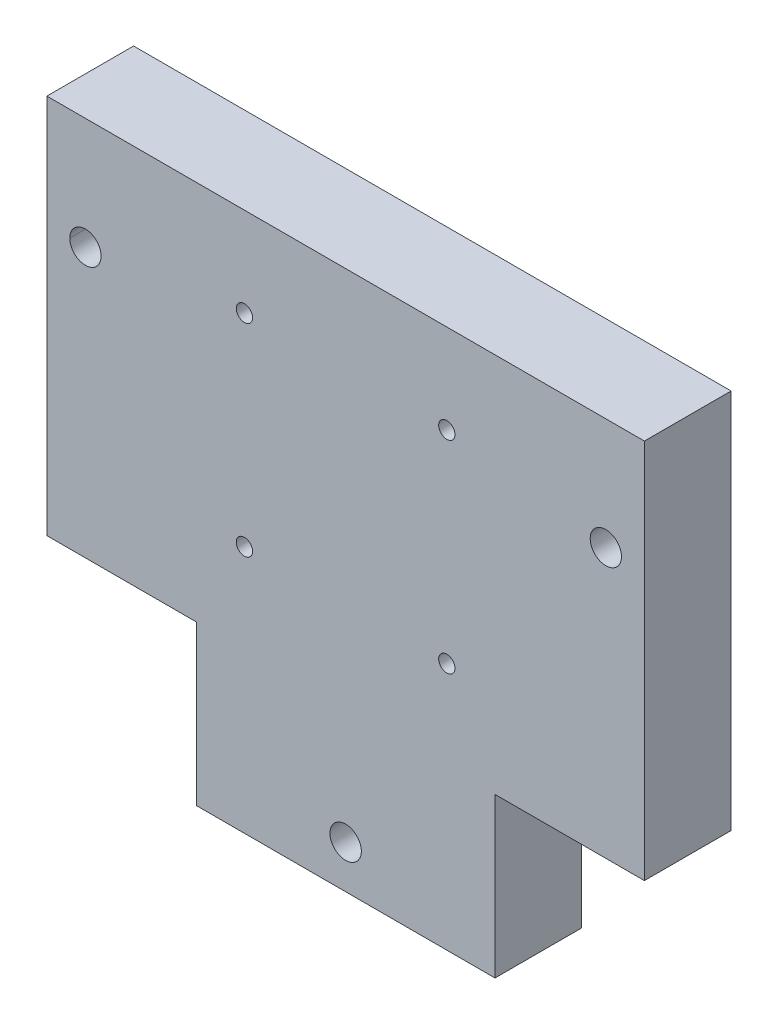
ISO-10303-21;
HEADER;
FILE_DESCRIPTION(('STEP AP214'),'2;1');
FILE_NAME('part.step','',(''),(''),'','','');
FILE_SCHEMA(('AUTOMOTIVE_DESIGN { 1 0 10303 214 1 1 1 1 }'));
ENDSEC;
DATA;
#1=APPLICATION_CONTEXT('core data for automotive mechanical design processes');
#2=APPLICATION_PROTOCOL_DEFINITION('international standard','automotive_design',2000,#1);
#3=PRODUCT_CONTEXT('',#1,'mechanical');
#4=PRODUCT('Part','Part','',(#3));
#5=PRODUCT_RELATED_PRODUCT_CATEGORY('part','',(#4));
#6=PRODUCT_DEFINITION_FORMATION('','',#4);
#7=PRODUCT_DEFINITION_CONTEXT('part definition',#1,'design');
#8=PRODUCT_DEFINITION('design','',#6,#7);
#9=PRODUCT_DEFINITION_SHAPE('','',#8);
#10=(LENGTH_UNIT() NAMED_UNIT(*) SI_UNIT(.MILLI.,.METRE.));
#11=(NAMED_UNIT(*) PLANE_ANGLE_UNIT() SI_UNIT($,.RADIAN.));
#12=(NAMED_UNIT(*) SI_UNIT($,.STERADIAN.) SOLID_ANGLE_UNIT());
#13=UNCERTAINTY_MEASURE_WITH_UNIT(LENGTH_MEASURE(1.E-05),#10,'distance_accuracy_value','');
#14=(GEOMETRIC_REPRESENTATION_CONTEXT(3) GLOBAL_UNCERTAINTY_ASSIGNED_CONTEXT((#13)) GLOBAL_UNIT_ASSIGNED_CONTEXT((#10,
#11,#12)) REPRESENTATION_CONTEXT('',''));
#15=CARTESIAN_POINT('',(0.,0.,0.));
#16=DIRECTION('',(0.,0.,1.));
#17=DIRECTION('',(1.,0.,0.));
#18=AXIS2_PLACEMENT_3D('',#15,#16,#17);
#19=CARTESIAN_POINT('',(21.0000994212728,-20.2002262396206,9.49960056521751));
#20=DIRECTION('',(-9.13544996192521E-05,0.000141096182968111,0.999999985873111));
#21=DIRECTION('',(0.,-0.999999990045933,0.000141096183556881));
#22=AXIS2_PLACEMENT_3D('',#19,#20,#21);
#23=CYLINDRICAL_SURFACE('',#22,1.69302641376225);
#24=CARTESIAN_POINT('',(20.9998253212629,-20.1998028946808,12.5000001862645));
#25=DIRECTION('',(0.,0.,-1.));
#26=DIRECTION('',(-0.543490157101904,0.839415540202436,0.));
#27=AXIS2_PLACEMENT_3D('',#24,#25,#26);
#28=ELLIPSE('',#27,1.69302643767944,1.69302641376225);
#29=CARTESIAN_POINT('',(20.0796821166708,-18.7786501929191,12.5000001862645));
#30=VERTEX_POINT('',#29);
#31=EDGE_CURVE('E48',#30,#30,#28,.F.);
#32=ORIENTED_EDGE('',*,*,#31,.T.);
#33=EDGE_LOOP('',(#32));
#34=FACE_BOUND('',#33,.T.);
#35=CARTESIAN_POINT('',(21.0000537075526,-20.200155635201,9.99999977648258));
#36=DIRECTION('',(0.,0.,-1.));
#37=DIRECTION('',(-0.543490157101904,0.839415540202436,0.));
#38=AXIS2_PLACEMENT_3D('',#35,#36,#37);
#39=ELLIPSE('',#38,1.69302643767944,1.69302641376225);
#40=CARTESIAN_POINT('',(20.0799105029605,-18.7790029334393,9.99999977648258));
#41=VERTEX_POINT('',#40);
#42=EDGE_CURVE('E11',#41,#41,#39,.T.);
#43=ORIENTED_EDGE('',*,*,#42,.T.);
#44=EDGE_LOOP('',(#43));
#45=FACE_BOUND('',#44,.T.);
#46=ADVANCED_FACE('F44',(#34,#45),#23,.F.);
#47=CARTESIAN_POINT('',(0.,0.,9.99999977648258));
#48=DIRECTION('',(0.,0.,-1.));
#49=DIRECTION('',(-1.,0.,0.));
#50=AXIS2_PLACEMENT_3D('',#47,#48,#49);
#51=PLANE('',#50);
#52=ORIENTED_EDGE('',*,*,#42,.F.);
#53=EDGE_LOOP('',(#52));
#54=FACE_BOUND('',#53,.T.);
#55=CARTESIAN_POINT('',(20.9999978455012,-20.2000122749202,9.99999977648258));
#56=DIRECTION('',(0.,0.,-1.));
#57=DIRECTION('',(-1.,0.,0.));
#58=AXIS2_PLACEMENT_3D('',#55,#56,#57);
#59=CIRCLE('',#58,3.24958794707544);
#60=CARTESIAN_POINT('',(17.7504098984257,-20.2000122749202,9.99999977648258));
#61=VERTEX_POINT('',#60);
#62=EDGE_CURVE('E298',#61,#61,#59,.T.);
#63=ORIENTED_EDGE('',*,*,#62,.T.);
#64=EDGE_LOOP('',(#63));
#65=FACE_BOUND('',#64,.T.);
#66=ADVANCED_FACE('F317',(#54,#65),#51,.T.);
#67=CARTESIAN_POINT('',(0.,0.,12.5000001862645));
#68=DIRECTION('',(0.,0.,-1.));
#69=DIRECTION('',(-1.,0.,0.));
#70=AXIS2_PLACEMENT_3D('',#67,#68,#69);
#71=PLANE('',#70);
#72=ORIENTED_EDGE('',*,*,#31,.F.);
#73=EDGE_LOOP('',(#72));
#74=FACE_BOUND('',#73,.T.);
#75=CARTESIAN_POINT('',(20.9998906302595,-62.1998686107718,12.5000001862645));
#76=DIRECTION('',(0.,0.,-1.));
#77=DIRECTION('',(-0.542457009571879,0.840083562966408,0.));
#78=AXIS2_PLACEMENT_3D('',#75,#76,#77);
#79=ELLIPSE('',#78,1.6930265143369,1.693026490353);
#80=CARTESIAN_POINT('',(20.0814965301664,-60.777584864411,12.5000001862645));
#81=VERTEX_POINT('',#80);
#82=EDGE_CURVE('E270',#81,#81,#79,.F.);
#83=ORIENTED_EDGE('',*,*,#82,.F.);
#84=EDGE_LOOP('',(#83));
#85=FACE_BOUND('',#84,.T.);
#86=CARTESIAN_POINT('',(-21.0001700776299,-20.1998009332168,12.5000001862645));
#87=DIRECTION('',(0.,0.,-1.));
#88=DIRECTION('',(-0.542863582539299,0.83982089206723,0.));
#89=AXIS2_PLACEMENT_3D('',#86,#87,#88);
#90=ELLIPSE('',#89,1.69302645938213,1.69302643547463);
#91=CARTESIAN_POINT('',(-21.9192524867039,-18.7779619418051,12.5000001862645));
#92=VERTEX_POINT('',#91);
#93=EDGE_CURVE('E271',#92,#92,#90,.F.);
#94=ORIENTED_EDGE('',*,*,#93,.F.);
#95=EDGE_LOOP('',(#94));
#96=FACE_BOUND('',#95,.T.);
#97=DIRECTION('',(0.,-1.,0.));
#98=VECTOR('',#97,1.);
#99=CARTESIAN_POINT('',(30.9999957680702,0.,12.5000001862645));
#100=LINE('',#99,#98);
#101=CARTESIAN_POINT('',(30.9999957680702,-80.700010061264,12.5000001862645));
#102=VERTEX_POINT('',#101);
#103=CARTESIAN_POINT('',(30.9999957680702,-113.70000988245,12.5000001862645));
#104=VERTEX_POINT('',#103);
#105=EDGE_CURVE('E163',#102,#104,#100,.T.);
#106=ORIENTED_EDGE('',*,*,#105,.F.);
#107=DIRECTION('',(1.,0.,0.));
#108=VECTOR('',#107,1.);
#109=CARTESIAN_POINT('',(0.,-80.700010061264,12.5000001862645));
#110=LINE('',#109,#108);
#111=CARTESIAN_POINT('',(61.9999952614307,-80.700010061264,12.5000001862645));
#112=VERTEX_POINT('',#111);
#113=EDGE_CURVE('E189',#102,#112,#110,.T.);
#114=ORIENTED_EDGE('',*,*,#113,.T.);
#115=DIRECTION('',(0.,-1.,0.));
#116=VECTOR('',#115,1.);
#117=CARTESIAN_POINT('',(61.9999952614307,0.,12.5000001862645));
#118=LINE('',#117,#116);
#119=CARTESIAN_POINT('',(61.9999952614307,-1.7000122461468,12.5000001862645));
#120=VERTEX_POINT('',#119);
#121=EDGE_CURVE('E132',#120,#112,#118,.T.);
#122=ORIENTED_EDGE('',*,*,#121,.F.);
#123=DIRECTION('',(-1.,0.,0.));
#124=VECTOR('',#123,1.);
#125=CARTESIAN_POINT('',(0.,-1.7000122461468,12.5000001862645));
#126=LINE('',#125,#124);
#127=CARTESIAN_POINT('',(-61.9999952614307,-1.7000122461468,12.5000001862645));
#128=VERTEX_POINT('',#127);
#129=EDGE_CURVE('E124',#120,#128,#126,.T.);
#130=ORIENTED_EDGE('',*,*,#129,.T.);
#131=DIRECTION('',(0.,-1.,0.));
#132=VECTOR('',#131,1.);
#133=CARTESIAN_POINT('',(-61.9999952614307,0.,12.5000001862645));
#134=LINE('',#133,#132);
#135=CARTESIAN_POINT('',(-61.9999952614307,-80.700010061264,12.5000001862645));
#136=VERTEX_POINT('',#135);
#137=EDGE_CURVE('E129',#128,#136,#134,.T.);
#138=ORIENTED_EDGE('',*,*,#137,.T.);
#139=DIRECTION('',(1.,0.,0.));
#140=VECTOR('',#139,1.);
#141=CARTESIAN_POINT('',(0.,-80.700010061264,12.5000001862645));
#142=LINE('',#141,#140);
#143=CARTESIAN_POINT('',(-30.9999957680702,-80.700010061264,12.5000001862645));
#144=VERTEX_POINT('',#143);
#145=EDGE_CURVE('E154',#136,#144,#142,.T.);
#146=ORIENTED_EDGE('',*,*,#145,.T.);
#147=DIRECTION('',(0.,-1.,0.));
#148=VECTOR('',#147,1.);
#149=CARTESIAN_POINT('',(-30.9999957680702,0.,12.5000001862645));
#150=LINE('',#149,#148);
#151=CARTESIAN_POINT('',(-30.9999957680702,-113.70000988245,12.5000001862645));
#152=VERTEX_POINT('',#151);
#153=EDGE_CURVE('E212',#144,#152,#150,.T.);
#154=ORIENTED_EDGE('',*,*,#153,.T.);
#155=DIRECTION('',(1.,0.,0.));
#156=VECTOR('',#155,1.);
#157=CARTESIAN_POINT('',(0.,-113.70000988245,12.5000001862645));
#158=LINE('',#157,#156);
#159=EDGE_CURVE('E168',#152,#104,#158,.T.);
#160=ORIENTED_EDGE('',*,*,#159,.T.);
#161=EDGE_LOOP('',(#106,#114,#122,#130,#138,#146,#154,#160));
#162=FACE_BOUND('',#161,.T.);
#163=CARTESIAN_POINT('',(-2.62684949260354E-05,-104.802861809733,12.5000001862645));
#164=DIRECTION('',(0.,0.,-1.));
#165=DIRECTION('',(-1.,0.,0.));
#166=AXIS2_PLACEMENT_3D('',#163,#164,#165);
#167=CIRCLE('',#166,3.25844640930602);
#168=CARTESIAN_POINT('',(-3.25847267780095,-104.802861809733,12.5000001862645));
#169=VERTEX_POINT('',#168);
#170=EDGE_CURVE('E206',#169,#169,#167,.F.);
#171=ORIENTED_EDGE('',*,*,#170,.F.);
#172=EDGE_LOOP('',(#171));
#173=FACE_BOUND('',#172,.T.);
#174=CARTESIAN_POINT('',(54.002082180397,-24.8557608755458,12.5000001862645));
#175=DIRECTION('',(0.,0.,-1.));
#176=DIRECTION('',(0.591464294699841,-0.806331190079622,0.));
#177=AXIS2_PLACEMENT_3D('',#174,#175,#176);
#178=ELLIPSE('',#177,3.24859697148728,3.24859673586021);
#179=CARTESIAN_POINT('',(55.9235112969017,-27.4752059376542,12.5000001862645));
#180=VERTEX_POINT('',#179);
#181=EDGE_CURVE('E218',#180,#180,#178,.F.);
#182=ORIENTED_EDGE('',*,*,#181,.F.);
#183=EDGE_LOOP('',(#182));
#184=FACE_BOUND('',#183,.T.);
#185=CARTESIAN_POINT('',(-54.0000051259997,-24.8401146382096,12.5000001862645));
#186=DIRECTION('',(0.,0.,-1.));
#187=DIRECTION('',(-1.,0.,0.));
#188=AXIS2_PLACEMENT_3D('',#185,#186,#187);
#189=CIRCLE('',#188,3.25126588995524);
#190=CARTESIAN_POINT('',(-50.7487785348697,-24.8561002666336,12.5000001862645));
#191=VERTEX_POINT('',#190);
#192=CARTESIAN_POINT('',(-57.2512575855917,-24.8494597536648,12.5000001862645));
#193=VERTEX_POINT('',#192);
#194=EDGE_CURVE('E147',#191,#193,#189,.F.);
#195=ORIENTED_EDGE('',*,*,#194,.F.);
#196=CARTESIAN_POINT('',(-54.0000312030563,-24.8656496405951,12.5000001862645));
#197=DIRECTION('',(0.,0.,-1.));
#198=DIRECTION('',(-1.,0.,0.));
#199=AXIS2_PLACEMENT_3D('',#196,#197,#198);
#200=CIRCLE('',#199,3.25126669206531);
#201=EDGE_CURVE('E148',#193,#191,#200,.F.);
#202=ORIENTED_EDGE('',*,*,#201,.F.);
#203=EDGE_LOOP('',(#195,#202));
#204=FACE_BOUND('',#203,.T.);
#205=CARTESIAN_POINT('',(-21.0001681093561,-62.1997977209587,12.5000001862645));
#206=DIRECTION('',(0.,0.,-1.));
#207=DIRECTION('',(-0.54183737135856,0.840483350816211,0.));
#208=AXIS2_PLACEMENT_3D('',#205,#206,#207);
#209=ELLIPSE('',#208,1.69302610858769,1.69302608461179);
#210=CARTESIAN_POINT('',(-21.9175129256747,-60.7768374641936,12.5000001862645));
#211=VERTEX_POINT('',#210);
#212=EDGE_CURVE('E293',#211,#211,#209,.F.);
#213=ORIENTED_EDGE('',*,*,#212,.F.);
#214=EDGE_LOOP('',(#213));
#215=FACE_BOUND('',#214,.T.);
#216=ADVANCED_FACE('F46',(#74,#85,#96,#162,#173,#184,#204,#215),#71,.F.);
#217=CARTESIAN_POINT('',(-20.9998945076006,-62.2002221245389,9.49959948268503));
#218=DIRECTION('',(-9.11884040580521E-05,0.000141448965039321,0.999999985838432));
#219=DIRECTION('',(0.,-0.999999989996095,0.000141448965627418));
#220=AXIS2_PLACEMENT_3D('',#217,#218,#219);
#221=CYLINDRICAL_SURFACE('',#220,1.69302608461179);
#222=ORIENTED_EDGE('',*,*,#212,.T.);
#223=EDGE_LOOP('',(#222));
#224=FACE_BOUND('',#223,.T.);
#225=CARTESIAN_POINT('',(-20.9999401383054,-62.2001513434343,9.99999977648258));
#226=DIRECTION('',(0.,0.,-1.));
#227=DIRECTION('',(-0.54183737135856,0.840483350816211,0.));
#228=AXIS2_PLACEMENT_3D('',#225,#226,#227);
#229=ELLIPSE('',#228,1.69302610858769,1.69302608461179);
#230=CARTESIAN_POINT('',(-21.917284954624,-60.7771910866692,9.99999977648258));
#231=VERTEX_POINT('',#230);
#232=EDGE_CURVE('E294',#231,#231,#229,.F.);
#233=ORIENTED_EDGE('',*,*,#232,.F.);
#234=EDGE_LOOP('',(#233));
#235=FACE_BOUND('',#234,.T.);
#236=ADVANCED_FACE('F316',(#224,#235),#221,.F.);
#237=CARTESIAN_POINT('',(0.,0.,9.99999977648258));
#238=DIRECTION('',(0.,0.,-1.));
#239=DIRECTION('',(-1.,0.,0.));
#240=AXIS2_PLACEMENT_3D('',#237,#238,#239);
#241=PLANE('',#240);
#242=ORIENTED_EDGE('',*,*,#232,.T.);
#243=EDGE_LOOP('',(#242));
#244=FACE_BOUND('',#243,.T.);
#245=CARTESIAN_POINT('',(-20.999996088729,-62.2000097985261,9.99999977648258));
#246=DIRECTION('',(0.,0.,-1.));
#247=DIRECTION('',(-1.,0.,0.));
#248=AXIS2_PLACEMENT_3D('',#245,#246,#247);
#249=CIRCLE('',#248,3.24958821333729);
#250=CARTESIAN_POINT('',(-17.7504078753917,-62.2000097985261,9.99999977648258));
#251=VERTEX_POINT('',#250);
#252=EDGE_CURVE('E282',#251,#251,#249,.T.);
#253=ORIENTED_EDGE('',*,*,#252,.T.);
#254=EDGE_LOOP('',(#253));
#255=FACE_BOUND('',#254,.T.);
#256=ADVANCED_FACE('F365',(#244,#255),#241,.T.);
#257=CARTESIAN_POINT('',(0.,0.,9.99999977648258));
#258=DIRECTION('',(0.,0.,-1.));
#259=DIRECTION('',(-1.,0.,0.));
#260=AXIS2_PLACEMENT_3D('',#257,#258,#259);
#261=PLANE('',#260);
#262=CARTESIAN_POINT('',(21.0001189000611,-62.2002221239624,9.99999977648258));
#263=DIRECTION('',(0.,0.,-1.));
#264=DIRECTION('',(-0.542457009571879,0.840083562966408,0.));
#265=AXIS2_PLACEMENT_3D('',#262,#263,#264);
#266=ELLIPSE('',#265,1.6930265143369,1.693026490353);
#267=CARTESIAN_POINT('',(20.081724799968,-60.7779383776017,9.99999977648258));
#268=VERTEX_POINT('',#267);
#269=EDGE_CURVE('E283',#268,#268,#266,.F.);
#270=ORIENTED_EDGE('',*,*,#269,.T.);
#271=EDGE_LOOP('',(#270));
#272=FACE_BOUND('',#271,.T.);
#273=CARTESIAN_POINT('',(20.9999977426427,-62.2000097886672,9.99999977648258));
#274=DIRECTION('',(0.,0.,-1.));
#275=DIRECTION('',(-1.,0.,0.));
#276=AXIS2_PLACEMENT_3D('',#273,#274,#275);
#277=CIRCLE('',#276,3.2495882133373);
#278=CARTESIAN_POINT('',(24.24958595598,-62.2000097886672,9.99999977648258));
#279=VERTEX_POINT('',#278);
#280=EDGE_CURVE('E278',#279,#279,#277,.F.);
#281=ORIENTED_EDGE('',*,*,#280,.F.);
#282=EDGE_LOOP('',(#281));
#283=FACE_BOUND('',#282,.T.);
#284=ADVANCED_FACE('F371',(#272,#283),#261,.T.);
#285=CARTESIAN_POINT('',(21.0001645905653,-62.2002928831947,9.49959946780032));
#286=DIRECTION('',(-9.13079043837159E-05,0.000141405251085624,0.999999985833711));
#287=DIRECTION('',(0.,-0.999999990002277,0.000141405251675081));
#288=AXIS2_PLACEMENT_3D('',#285,#286,#287);
#289=CYLINDRICAL_SURFACE('',#288,1.693026490353);
#290=ORIENTED_EDGE('',*,*,#82,.T.);
#291=EDGE_LOOP('',(#290));
#292=FACE_BOUND('',#291,.T.);
#293=ORIENTED_EDGE('',*,*,#269,.F.);
#294=EDGE_LOOP('',(#293));
#295=FACE_BOUND('',#294,.T.);
#296=ADVANCED_FACE('F332',(#292,#295),#289,.F.);
#297=CARTESIAN_POINT('',(0.,0.,9.99999977648258));
#298=DIRECTION('',(0.,0.,-1.));
#299=DIRECTION('',(-1.,0.,0.));
#300=AXIS2_PLACEMENT_3D('',#297,#298,#299);
#301=PLANE('',#300);
#302=CARTESIAN_POINT('',(-20.9999420008777,-20.2001537725445,9.99999977648258));
#303=DIRECTION('',(0.,0.,-1.));
#304=DIRECTION('',(-0.542863582539299,0.83982089206723,0.));
#305=AXIS2_PLACEMENT_3D('',#302,#303,#304);
#306=ELLIPSE('',#305,1.69302645938213,1.69302643547463);
#307=CARTESIAN_POINT('',(-21.9190244099517,-18.7783147811328,9.99999977648258));
#308=VERTEX_POINT('',#307);
#309=EDGE_CURVE('E136',#308,#308,#306,.F.);
#310=ORIENTED_EDGE('',*,*,#309,.T.);
#311=EDGE_LOOP('',(#310));
#312=FACE_BOUND('',#311,.T.);
#313=CARTESIAN_POINT('',(-20.9999978486219,-20.2000122850749,9.99999977648258));
#314=DIRECTION('',(0.,0.,-1.));
#315=DIRECTION('',(-1.,0.,0.));
#316=AXIS2_PLACEMENT_3D('',#313,#314,#315);
#317=CIRCLE('',#316,3.24958794707544);
#318=CARTESIAN_POINT('',(-24.2495857956973,-20.2000122850749,9.99999977648258));
#319=VERTEX_POINT('',#318);
#320=EDGE_CURVE('E266',#319,#319,#317,.F.);
#321=ORIENTED_EDGE('',*,*,#320,.F.);
#322=EDGE_LOOP('',(#321));
#323=FACE_BOUND('',#322,.T.);
#324=ADVANCED_FACE('F326',(#312,#323),#301,.T.);
#325=CARTESIAN_POINT('',(-20.9998963491161,-20.2002243967388,9.49960058403672));
#326=DIRECTION('',(-9.12306846507179E-05,0.000141135705970337,0.999999985878837));
#327=DIRECTION('',(0.,-0.999999990040356,0.000141135706557676));
#328=AXIS2_PLACEMENT_3D('',#325,#326,#327);
#329=CYLINDRICAL_SURFACE('',#328,1.69302643547463);
#330=ORIENTED_EDGE('',*,*,#93,.T.);
#331=EDGE_LOOP('',(#330));
#332=FACE_BOUND('',#331,.T.);
#333=ORIENTED_EDGE('',*,*,#309,.F.);
#334=EDGE_LOOP('',(#333));
#335=FACE_BOUND('',#334,.T.);
#336=ADVANCED_FACE('F322',(#332,#335),#329,.F.);
#337=CARTESIAN_POINT('',(0.,0.,-5.49999997019768));
#338=DIRECTION('',(0.,0.,-1.));
#339=DIRECTION('',(-1.,0.,0.));
#340=AXIS2_PLACEMENT_3D('',#337,#338,#339);
#341=PLANE('',#340);
#342=DIRECTION('',(0.,1.,0.));
#343=VECTOR('',#342,1.);
#344=CARTESIAN_POINT('',(-30.9999957680702,0.,-5.49999997019768));
#345=LINE('',#344,#343);
#346=CARTESIAN_POINT('',(-30.9999957680702,-113.70000988245,-5.49999997019768));
#347=VERTEX_POINT('',#346);
#348=CARTESIAN_POINT('',(-30.9999957680702,-80.700010061264,-5.49999997019768));
#349=VERTEX_POINT('',#348);
#350=EDGE_CURVE('E183',#347,#349,#345,.T.);
#351=ORIENTED_EDGE('',*,*,#350,.T.);
#352=DIRECTION('',(-1.,0.,0.));
#353=VECTOR('',#352,1.);
#354=CARTESIAN_POINT('',(0.,-80.700010061264,-5.49999997019768));
#355=LINE('',#354,#353);
#356=CARTESIAN_POINT('',(-61.9999952614307,-80.700010061264,-5.49999997019768));
#357=VERTEX_POINT('',#356);
#358=EDGE_CURVE('E176',#349,#357,#355,.T.);
#359=ORIENTED_EDGE('',*,*,#358,.T.);
#360=DIRECTION('',(0.,1.,0.));
#361=VECTOR('',#360,1.);
#362=CARTESIAN_POINT('',(-61.9999952614307,0.,-5.49999997019768));
#363=LINE('',#362,#361);
#364=CARTESIAN_POINT('',(-61.9999952614307,-1.70001224614679,-5.49999997019768));
#365=VERTEX_POINT('',#364);
#366=EDGE_CURVE('E172',#357,#365,#363,.T.);
#367=ORIENTED_EDGE('',*,*,#366,.T.);
#368=DIRECTION('',(1.,0.,0.));
#369=VECTOR('',#368,1.);
#370=CARTESIAN_POINT('',(0.,-1.7000122461468,-5.49999997019768));
#371=LINE('',#370,#369);
#372=CARTESIAN_POINT('',(61.9999952614307,-1.70001224614679,-5.49999997019768));
#373=VERTEX_POINT('',#372);
#374=EDGE_CURVE('E142',#365,#373,#371,.T.);
#375=ORIENTED_EDGE('',*,*,#374,.T.);
#376=DIRECTION('',(0.,1.,0.));
#377=VECTOR('',#376,1.);
#378=CARTESIAN_POINT('',(61.9999952614307,0.,-5.49999997019768));
#379=LINE('',#378,#377);
#380=CARTESIAN_POINT('',(61.9999952614307,-80.700010061264,-5.49999997019768));
#381=VERTEX_POINT('',#380);
#382=EDGE_CURVE('E177',#381,#373,#379,.T.);
#383=ORIENTED_EDGE('',*,*,#382,.F.);
#384=DIRECTION('',(-1.,0.,0.));
#385=VECTOR('',#384,1.);
#386=CARTESIAN_POINT('',(0.,-80.700010061264,-5.49999997019768));
#387=LINE('',#386,#385);
#388=CARTESIAN_POINT('',(30.9999957680702,-80.700010061264,-5.49999997019768));
#389=VERTEX_POINT('',#388);
#390=EDGE_CURVE('E180',#381,#389,#387,.T.);
#391=ORIENTED_EDGE('',*,*,#390,.T.);
#392=DIRECTION('',(0.,1.,0.));
#393=VECTOR('',#392,1.);
#394=CARTESIAN_POINT('',(30.9999957680702,0.,-5.49999997019768));
#395=LINE('',#394,#393);
#396=CARTESIAN_POINT('',(30.9999957680702,-113.70000988245,-5.49999997019768));
#397=VERTEX_POINT('',#396);
#398=EDGE_CURVE('E60',#397,#389,#395,.T.);
#399=ORIENTED_EDGE('',*,*,#398,.F.);
#400=DIRECTION('',(-1.,0.,0.));
#401=VECTOR('',#400,1.);
#402=CARTESIAN_POINT('',(0.,-113.70000988245,-5.49999997019768));
#403=LINE('',#402,#401);
#404=EDGE_CURVE('E184',#397,#347,#403,.T.);
#405=ORIENTED_EDGE('',*,*,#404,.T.);
#406=EDGE_LOOP('',(#351,#359,#367,#375,#383,#391,#399,#405));
#407=FACE_BOUND('',#406,.T.);
#408=CARTESIAN_POINT('',(20.9999978542328,-20.2000122517347,-5.49999997019768));
#409=DIRECTION('',(0.,0.,-1.));
#410=DIRECTION('',(-1.,0.,0.));
#411=AXIS2_PLACEMENT_3D('',#408,#409,#410);
#412=CIRCLE('',#411,3.24958794707544);
#413=CARTESIAN_POINT('',(17.7504099071573,-20.2000122517347,-5.49999997019768));
#414=VERTEX_POINT('',#413);
#415=EDGE_CURVE('E192',#414,#414,#412,.T.);
#416=ORIENTED_EDGE('',*,*,#415,.F.);
#417=EDGE_LOOP('',(#416));
#418=FACE_BOUND('',#417,.T.);
#419=CARTESIAN_POINT('',(20.9999978542328,-62.2000098228455,-5.49999997019768));
#420=DIRECTION('',(0.,0.,-1.));
#421=DIRECTION('',(-1.,0.,0.));
#422=AXIS2_PLACEMENT_3D('',#419,#420,#421);
#423=CIRCLE('',#422,3.2495882133373);
#424=CARTESIAN_POINT('',(24.2495860675701,-62.2000098228455,-5.49999997019768));
#425=VERTEX_POINT('',#424);
#426=EDGE_CURVE('E227',#425,#425,#423,.T.);
#427=ORIENTED_EDGE('',*,*,#426,.F.);
#428=EDGE_LOOP('',(#427));
#429=FACE_BOUND('',#428,.T.);
#430=CARTESIAN_POINT('',(-20.9999978542328,-20.2000122517347,-5.49999997019768));
#431=DIRECTION('',(0.,0.,-1.));
#432=DIRECTION('',(-1.,0.,0.));
#433=AXIS2_PLACEMENT_3D('',#430,#431,#432);
#434=CIRCLE('',#433,3.24958794707544);
#435=CARTESIAN_POINT('',(-24.2495858013082,-20.2000122517347,-5.49999997019768));
#436=VERTEX_POINT('',#435);
#437=EDGE_CURVE('E222',#436,#436,#434,.T.);
#438=ORIENTED_EDGE('',*,*,#437,.F.);
#439=EDGE_LOOP('',(#438));
#440=FACE_BOUND('',#439,.T.);
#441=CARTESIAN_POINT('',(-20.9999959915876,-62.2000098228455,-5.49999997019768));
#442=DIRECTION('',(0.,0.,-1.));
#443=DIRECTION('',(-1.,0.,0.));
#444=AXIS2_PLACEMENT_3D('',#441,#442,#443);
#445=CIRCLE('',#444,3.24958821333729);
#446=CARTESIAN_POINT('',(-17.7504077782503,-62.2000098228455,-5.49999997019768));
#447=VERTEX_POINT('',#446);
#448=EDGE_CURVE('E175',#447,#447,#445,.T.);
#449=ORIENTED_EDGE('',*,*,#448,.F.);
#450=EDGE_LOOP('',(#449));
#451=FACE_BOUND('',#450,.T.);
#452=CARTESIAN_POINT('',(-2.62684949260354E-05,-104.802861809733,-5.49999997019768));
#453=DIRECTION('',(0.,0.,-1.));
#454=DIRECTION('',(-1.,0.,0.));
#455=AXIS2_PLACEMENT_3D('',#452,#453,#454);
#456=CIRCLE('',#455,3.25844640930602);
#457=CARTESIAN_POINT('',(-3.25847267780095,-104.802861809733,-5.49999997019768));
#458=VERTEX_POINT('',#457);
#459=EDGE_CURVE('E243',#458,#458,#456,.T.);
#460=ORIENTED_EDGE('',*,*,#459,.F.);
#461=EDGE_LOOP('',(#460));
#462=FACE_BOUND('',#461,.T.);
#463=CARTESIAN_POINT('',(53.9980272749427,-24.8502329057768,-5.49999997019768));
#464=DIRECTION('',(0.,0.,-1.));
#465=DIRECTION('',(0.591464294699841,-0.806331190079622,0.));
#466=AXIS2_PLACEMENT_3D('',#463,#464,#465);
#467=ELLIPSE('',#466,3.24859697148728,3.24859673586021);
#468=CARTESIAN_POINT('',(55.9194563914475,-27.4696779678851,-5.49999997019768));
#469=VERTEX_POINT('',#468);
#470=EDGE_CURVE('E239',#469,#469,#467,.T.);
#471=ORIENTED_EDGE('',*,*,#470,.F.);
#472=EDGE_LOOP('',(#471));
#473=FACE_BOUND('',#472,.T.);
#474=CARTESIAN_POINT('',(-54.0000051259997,-24.8401146382096,-5.49999997019768));
#475=DIRECTION('',(0.,0.,-1.));
#476=DIRECTION('',(-1.,0.,0.));
#477=AXIS2_PLACEMENT_3D('',#474,#475,#476);
#478=CIRCLE('',#477,3.25126588995524);
#479=CARTESIAN_POINT('',(-57.251257585589,-24.8494597546039,-5.49999997019768));
#480=VERTEX_POINT('',#479);
#481=CARTESIAN_POINT('',(-50.7487785348651,-24.8561002656839,-5.49999997019768));
#482=VERTEX_POINT('',#481);
#483=EDGE_CURVE('E68',#480,#482,#478,.T.);
#484=ORIENTED_EDGE('',*,*,#483,.F.);
#485=CARTESIAN_POINT('',(-54.0000312030315,-24.8656496405602,-5.49999997019768));
#486=DIRECTION('',(0.,0.,-1.));
#487=DIRECTION('',(-1.,0.,0.));
#488=AXIS2_PLACEMENT_3D('',#485,#486,#487);
#489=CIRCLE('',#488,3.25126669206531);
#490=EDGE_CURVE('E223',#482,#480,#489,.T.);
#491=ORIENTED_EDGE('',*,*,#490,.F.);
#492=EDGE_LOOP('',(#484,#491));
#493=FACE_BOUND('',#492,.T.);
#494=ADVANCED_FACE('F325',(#407,#418,#429,#440,#451,#462,#473,#493),#341,.T.);
#495=CARTESIAN_POINT('',(-54.0000051259997,-24.8401146382096,-9.10000000149512));
#496=DIRECTION('',(0.,0.,1.));
#497=DIRECTION('',(1.,0.,0.));
#498=AXIS2_PLACEMENT_3D('',#495,#496,#497);
#499=CYLINDRICAL_SURFACE('',#498,3.25126588995524);
#500=ORIENTED_EDGE('',*,*,#483,.T.);
#501=DIRECTION('',(-1.37553010200749E-12,-1.93932862048289E-12,1.));
#502=VECTOR('',#501,1.);
#503=CARTESIAN_POINT('',(-50.7487785348604,-24.8561002647343,1.70000009239238));
#504=LINE('',#503,#502);
#505=EDGE_CURVE('E216',#482,#191,#504,.T.);
#506=ORIENTED_EDGE('',*,*,#505,.T.);
#507=ORIENTED_EDGE('',*,*,#194,.T.);
#508=DIRECTION('',(-1.37553010200749E-12,-1.93932862048289E-12,1.));
#509=VECTOR('',#508,1.);
#510=CARTESIAN_POINT('',(-57.2512575855863,-24.8494597555431,1.70000009238345));
#511=LINE('',#510,#509);
#512=EDGE_CURVE('E258',#193,#480,#511,.F.);
#513=ORIENTED_EDGE('',*,*,#512,.T.);
#514=EDGE_LOOP('',(#500,#506,#507,#513));
#515=FACE_BOUND('',#514,.T.);
#516=ADVANCED_FACE('F345',(#515),#499,.F.);
#517=CARTESIAN_POINT('',(-54.0000312030266,-24.8656496405532,-9.10000000149196));
#518=DIRECTION('',(-1.37553010200749E-12,-1.93932862048289E-12,1.));
#519=DIRECTION('',(0.,-1.,-1.93932862048289E-12));
#520=AXIS2_PLACEMENT_3D('',#517,#518,#519);
#521=CYLINDRICAL_SURFACE('',#520,3.25126669206531);
#522=ORIENTED_EDGE('',*,*,#490,.T.);
#523=ORIENTED_EDGE('',*,*,#512,.F.);
#524=ORIENTED_EDGE('',*,*,#201,.T.);
#525=ORIENTED_EDGE('',*,*,#505,.F.);
#526=EDGE_LOOP('',(#522,#523,#524,#525));
#527=FACE_BOUND('',#526,.T.);
#528=ADVANCED_FACE('F358',(#527),#521,.F.);
#529=CARTESIAN_POINT('',(53.9972159045181,-24.8491267810522,-9.10172828050024));
#530=DIRECTION('',(0.000225272506939488,-0.000307109406671655,0.999999927468052));
#531=DIRECTION('',(0.,-0.999999952841903,-0.000307109414464204));
#532=AXIS2_PLACEMENT_3D('',#529,#530,#531);
#533=CYLINDRICAL_SURFACE('',#532,3.24859673586021);
#534=ORIENTED_EDGE('',*,*,#181,.T.);
#535=EDGE_LOOP('',(#534));
#536=FACE_BOUND('',#535,.T.);
#537=ORIENTED_EDGE('',*,*,#470,.T.);
#538=EDGE_LOOP('',(#537));
#539=FACE_BOUND('',#538,.T.);
#540=ADVANCED_FACE('F403',(#536,#539),#533,.F.);
#541=CARTESIAN_POINT('',(-2.62684949260354E-05,-104.802861809733,-9.10000000156837));
#542=DIRECTION('',(0.,0.,1.));
#543=DIRECTION('',(1.,0.,0.));
#544=AXIS2_PLACEMENT_3D('',#541,#542,#543);
#545=CYLINDRICAL_SURFACE('',#544,3.25844640930602);
#546=ORIENTED_EDGE('',*,*,#170,.T.);
#547=EDGE_LOOP('',(#546));
#548=FACE_BOUND('',#547,.T.);
#549=ORIENTED_EDGE('',*,*,#459,.T.);
#550=EDGE_LOOP('',(#549));
#551=FACE_BOUND('',#550,.T.);
#552=ADVANCED_FACE('F399',(#548,#551),#545,.F.);
#553=CARTESIAN_POINT('',(0.,-80.700010061264,0.));
#554=DIRECTION('',(0.,-1.,0.));
#555=DIRECTION('',(0.,0.,-1.));
#556=AXIS2_PLACEMENT_3D('',#553,#554,#555);
#557=PLANE('',#556);
#558=DIRECTION('',(0.,0.,1.));
#559=VECTOR('',#558,1.);
#560=CARTESIAN_POINT('',(-30.9999957680702,-80.700010061264,0.));
#561=LINE('',#560,#559);
#562=EDGE_CURVE('E158',#349,#144,#561,.T.);
#563=ORIENTED_EDGE('',*,*,#562,.T.);
#564=ORIENTED_EDGE('',*,*,#145,.F.);
#565=DIRECTION('',(0.,0.,-1.));
#566=VECTOR('',#565,1.);
#567=CARTESIAN_POINT('',(-61.9999952614307,-80.700010061264,0.));
#568=LINE('',#567,#566);
#569=EDGE_CURVE('E152',#136,#357,#568,.T.);
#570=ORIENTED_EDGE('',*,*,#569,.T.);
#571=ORIENTED_EDGE('',*,*,#358,.F.);
#572=EDGE_LOOP('',(#563,#564,#570,#571));
#573=FACE_BOUND('',#572,.T.);
#574=ADVANCED_FACE('F402',(#573),#557,.T.);
#575=CARTESIAN_POINT('',(0.,-80.700010061264,0.));
#576=DIRECTION('',(0.,-1.,0.));
#577=DIRECTION('',(0.,0.,-1.));
#578=AXIS2_PLACEMENT_3D('',#575,#576,#577);
#579=PLANE('',#578);
#580=DIRECTION('',(0.,0.,-1.));
#581=VECTOR('',#580,1.);
#582=CARTESIAN_POINT('',(61.9999952614307,-80.700010061264,0.));
#583=LINE('',#582,#581);
#584=EDGE_CURVE('E185',#112,#381,#583,.T.);
#585=ORIENTED_EDGE('',*,*,#584,.F.);
#586=ORIENTED_EDGE('',*,*,#113,.F.);
#587=DIRECTION('',(0.,0.,1.));
#588=VECTOR('',#587,1.);
#589=CARTESIAN_POINT('',(30.9999957680702,-80.700010061264,0.));
#590=LINE('',#589,#588);
#591=EDGE_CURVE('E167',#389,#102,#590,.T.);
#592=ORIENTED_EDGE('',*,*,#591,.F.);
#593=ORIENTED_EDGE('',*,*,#390,.F.);
#594=EDGE_LOOP('',(#585,#586,#592,#593));
#595=FACE_BOUND('',#594,.T.);
#596=ADVANCED_FACE('F433',(#595),#579,.T.);
#597=CARTESIAN_POINT('',(0.,-113.70000988245,0.));
#598=DIRECTION('',(0.,-1.,0.));
#599=DIRECTION('',(0.,0.,-1.));
#600=AXIS2_PLACEMENT_3D('',#597,#598,#599);
#601=PLANE('',#600);
#602=DIRECTION('',(0.,0.,-1.));
#603=VECTOR('',#602,1.);
#604=CARTESIAN_POINT('',(30.9999957680702,-113.70000988245,0.));
#605=LINE('',#604,#603);
#606=EDGE_CURVE('E171',#104,#397,#605,.T.);
#607=ORIENTED_EDGE('',*,*,#606,.F.);
#608=ORIENTED_EDGE('',*,*,#159,.F.);
#609=DIRECTION('',(0.,0.,-1.));
#610=VECTOR('',#609,1.);
#611=CARTESIAN_POINT('',(-30.9999957680702,-113.70000988245,0.));
#612=LINE('',#611,#610);
#613=EDGE_CURVE('E197',#152,#347,#612,.T.);
#614=ORIENTED_EDGE('',*,*,#613,.T.);
#615=ORIENTED_EDGE('',*,*,#404,.F.);
#616=EDGE_LOOP('',(#607,#608,#614,#615));
#617=FACE_BOUND('',#616,.T.);
#618=ADVANCED_FACE('F441',(#617),#601,.T.);
#619=CARTESIAN_POINT('',(-30.9999957680702,0.,0.));
#620=DIRECTION('',(-1.,0.,0.));
#621=DIRECTION('',(0.,0.,1.));
#622=AXIS2_PLACEMENT_3D('',#619,#620,#621);
#623=PLANE('',#622);
#624=ORIENTED_EDGE('',*,*,#613,.F.);
#625=ORIENTED_EDGE('',*,*,#153,.F.);
#626=ORIENTED_EDGE('',*,*,#562,.F.);
#627=ORIENTED_EDGE('',*,*,#350,.F.);
#628=EDGE_LOOP('',(#624,#625,#626,#627));
#629=FACE_BOUND('',#628,.T.);
#630=ADVANCED_FACE('F449',(#629),#623,.T.);
#631=CARTESIAN_POINT('',(0.,-1.7000122461468,0.));
#632=DIRECTION('',(0.,1.,0.));
#633=DIRECTION('',(0.,0.,1.));
#634=AXIS2_PLACEMENT_3D('',#631,#632,#633);
#635=PLANE('',#634);
#636=DIRECTION('',(0.,0.,-1.));
#637=VECTOR('',#636,1.);
#638=CARTESIAN_POINT('',(-61.9999952614307,-1.7000122461468,0.));
#639=LINE('',#638,#637);
#640=EDGE_CURVE('E139',#128,#365,#639,.T.);
#641=ORIENTED_EDGE('',*,*,#640,.F.);
#642=ORIENTED_EDGE('',*,*,#129,.F.);
#643=DIRECTION('',(0.,0.,-1.));
#644=VECTOR('',#643,1.);
#645=CARTESIAN_POINT('',(61.9999952614307,-1.7000122461468,0.));
#646=LINE('',#645,#644);
#647=EDGE_CURVE('E215',#120,#373,#646,.T.);
#648=ORIENTED_EDGE('',*,*,#647,.T.);
#649=ORIENTED_EDGE('',*,*,#374,.F.);
#650=EDGE_LOOP('',(#641,#642,#648,#649));
#651=FACE_BOUND('',#650,.T.);
#652=ADVANCED_FACE('F140',(#651),#635,.T.);
#653=CARTESIAN_POINT('',(-61.9999952614307,0.,0.));
#654=DIRECTION('',(-1.,0.,0.));
#655=DIRECTION('',(0.,0.,1.));
#656=AXIS2_PLACEMENT_3D('',#653,#654,#655);
#657=PLANE('',#656);
#658=ORIENTED_EDGE('',*,*,#569,.F.);
#659=ORIENTED_EDGE('',*,*,#137,.F.);
#660=ORIENTED_EDGE('',*,*,#640,.T.);
#661=ORIENTED_EDGE('',*,*,#366,.F.);
#662=EDGE_LOOP('',(#658,#659,#660,#661));
#663=FACE_BOUND('',#662,.T.);
#664=ADVANCED_FACE('F150',(#663),#657,.T.);
#665=CARTESIAN_POINT('',(-20.999997855355,-20.2000122450667,-8.59999992236388));
#666=DIRECTION('',(3.61994954339224E-10,-2.15098028928592E-09,1.));
#667=DIRECTION('',(0.,-1.,-2.15098028928592E-09));
#668=AXIS2_PLACEMENT_3D('',#665,#666,#667);
#669=CYLINDRICAL_SURFACE('',#668,3.24958794707544);
#670=ORIENTED_EDGE('',*,*,#320,.T.);
#671=EDGE_LOOP('',(#670));
#672=FACE_BOUND('',#671,.T.);
#673=ORIENTED_EDGE('',*,*,#437,.T.);
#674=EDGE_LOOP('',(#673));
#675=FACE_BOUND('',#674,.T.);
#676=ADVANCED_FACE('F336',(#672,#675),#669,.F.);
#677=CARTESIAN_POINT('',(-20.9999959721594,-62.2000098277093,-8.5999999279271));
#678=DIRECTION('',(-6.26718258709153E-09,1.56898746371833E-09,1.));
#679=DIRECTION('',(1.,0.,6.26718258709153E-09));
#680=AXIS2_PLACEMENT_3D('',#677,#678,#679);
#681=CYLINDRICAL_SURFACE('',#680,3.24958821333729);
#682=CARTESIAN_POINT('',(-17.7504078753917,-62.2000097985261,9.99999977648258));
#683=CARTESIAN_POINT('',(-17.7504078743798,-62.2000097987795,9.838541445788));
#684=CARTESIAN_POINT('',(-17.7504078733679,-62.2000097990328,9.67708311509341));
#685=CARTESIAN_POINT('',(-17.7504078713441,-62.2000097995395,9.35416645370424));
#686=CARTESIAN_POINT('',(-17.7504078703322,-62.2000097997928,9.19270812300965));
#687=CARTESIAN_POINT('',(-17.7504078683085,-62.2000098002994,8.86979146162048));
#688=CARTESIAN_POINT('',(-17.7504078672966,-62.2000098005528,8.70833313092589));
#689=CARTESIAN_POINT('',(-17.7504078652728,-62.2000098010594,8.38541646953672));
#690=CARTESIAN_POINT('',(-17.7504078642609,-62.2000098013127,8.22395813884214));
#691=CARTESIAN_POINT('',(-17.7504078622371,-62.2000098018194,7.90104147745296));
#692=CARTESIAN_POINT('',(-17.7504078612252,-62.2000098020727,7.73958314675838));
#693=CARTESIAN_POINT('',(-17.7504078592015,-62.2000098025794,7.41666648536921));
#694=CARTESIAN_POINT('',(-17.7504078581896,-62.2000098028327,7.25520815467462));
#695=CARTESIAN_POINT('',(-17.7504078561658,-62.2000098033393,6.93229149328545));
#696=CARTESIAN_POINT('',(-17.7504078551539,-62.2000098035927,6.77083316259086));
#697=CARTESIAN_POINT('',(-17.7504078531301,-62.2000098040993,6.44791650120169));
#698=CARTESIAN_POINT('',(-17.7504078521182,-62.2000098043527,6.2864581705071));
#699=CARTESIAN_POINT('',(-17.7504078500945,-62.2000098048593,5.96354150911793));
#700=CARTESIAN_POINT('',(-17.7504078490826,-62.2000098051126,5.80208317842335));
#701=CARTESIAN_POINT('',(-17.7504078470588,-62.2000098056193,5.47916651703417));
#702=CARTESIAN_POINT('',(-17.7504078460469,-62.2000098058726,5.31770818633959));
#703=CARTESIAN_POINT('',(-17.7504078440231,-62.2000098063793,4.99479152495041));
#704=CARTESIAN_POINT('',(-17.7504078430112,-62.2000098066326,4.83333319425583));
#705=CARTESIAN_POINT('',(-17.7504078409875,-62.2000098071392,4.51041653286666));
#706=CARTESIAN_POINT('',(-17.7504078399756,-62.2000098073926,4.34895820217207));
#707=CARTESIAN_POINT('',(-17.7504078379518,-62.2000098078992,4.0260415407829));
#708=CARTESIAN_POINT('',(-17.7504078369399,-62.2000098081525,3.86458321008831));
#709=CARTESIAN_POINT('',(-17.7504078349161,-62.2000098086592,3.54166654869914));
#710=CARTESIAN_POINT('',(-17.7504078339042,-62.2000098089125,3.38020821800455));
#711=CARTESIAN_POINT('',(-17.7504078318805,-62.2000098094192,3.05729155661538));
#712=CARTESIAN_POINT('',(-17.7504078308686,-62.2000098096725,2.8958332259208));
#713=CARTESIAN_POINT('',(-17.7504078288448,-62.2000098101792,2.57291656453162));
#714=CARTESIAN_POINT('',(-17.7504078278329,-62.2000098104325,2.41145823383704));
#715=CARTESIAN_POINT('',(-17.7504078258091,-62.2000098109391,2.08854157244787));
#716=CARTESIAN_POINT('',(-17.7504078247972,-62.2000098111925,1.92708324175328));
#717=CARTESIAN_POINT('',(-17.7504078227735,-62.2000098116991,1.60416658036411));
#718=CARTESIAN_POINT('',(-17.7504078217616,-62.2000098119524,1.44270824966952));
#719=CARTESIAN_POINT('',(-17.7504078197378,-62.2000098124591,1.11979158828035));
#720=CARTESIAN_POINT('',(-17.7504078187259,-62.2000098127124,0.958333257585764));
#721=CARTESIAN_POINT('',(-17.7504078167021,-62.2000098132191,0.635416596196592));
#722=CARTESIAN_POINT('',(-17.7504078156902,-62.2000098134724,0.473958265502006));
#723=CARTESIAN_POINT('',(-17.7504078136665,-62.200009813979,0.151041604112834));
#724=CARTESIAN_POINT('',(-17.7504078126546,-62.2000098142324,-0.0104167265817523));
#725=CARTESIAN_POINT('',(-17.7504078106308,-62.200009814739,-0.333333387970924));
#726=CARTESIAN_POINT('',(-17.7504078096189,-62.2000098149923,-0.49479171866551));
#727=CARTESIAN_POINT('',(-17.7504078075951,-62.200009815499,-0.817708380054682));
#728=CARTESIAN_POINT('',(-17.7504078065832,-62.2000098157523,-0.979166710749269));
#729=CARTESIAN_POINT('',(-17.7504078045595,-62.200009816259,-1.30208337213844));
#730=CARTESIAN_POINT('',(-17.7504078035476,-62.2000098165123,-1.46354170283303));
#731=CARTESIAN_POINT('',(-17.7504078015238,-62.200009817019,-1.7864583642222));
#732=CARTESIAN_POINT('',(-17.7504078005119,-62.2000098172723,-1.94791669491678));
#733=CARTESIAN_POINT('',(-17.7504077984881,-62.2000098177789,-2.27083335630596));
#734=CARTESIAN_POINT('',(-17.7504077974762,-62.2000098180323,-2.43229168700054));
#735=CARTESIAN_POINT('',(-17.7504077954525,-62.2000098185389,-2.75520834838971));
#736=CARTESIAN_POINT('',(-17.7504077944406,-62.2000098187922,-2.9166666790843));
#737=CARTESIAN_POINT('',(-17.7504077924168,-62.2000098192989,-3.23958334047347));
#738=CARTESIAN_POINT('',(-17.7504077914049,-62.2000098195522,-3.40104167116806));
#739=CARTESIAN_POINT('',(-17.7504077893811,-62.2000098200589,-3.72395833255723));
#740=CARTESIAN_POINT('',(-17.7504077883692,-62.2000098203122,-3.88541666325182));
#741=CARTESIAN_POINT('',(-17.7504077863455,-62.2000098208188,-4.20833332464099));
#742=CARTESIAN_POINT('',(-17.7504077853336,-62.2000098210722,-4.36979165533558));
#743=CARTESIAN_POINT('',(-17.7504077833098,-62.2000098215788,-4.69270831672475));
#744=CARTESIAN_POINT('',(-17.7504077822979,-62.2000098218322,-4.85416664741933));
#745=CARTESIAN_POINT('',(-17.7504077802741,-62.2000098223388,-5.17708330880851));
#746=CARTESIAN_POINT('',(-17.7504077792622,-62.2000098225921,-5.33854163950309));
#747=CARTESIAN_POINT('',(-17.7504077782503,-62.2000098228455,-5.49999997019768));
#748=B_SPLINE_CURVE_WITH_KNOTS('',3,(#682,#683,#684,#685,#686,#687,#688,#689,#690,#691,#692,
#693,#694,#695,#696,#697,#698,#699,#700,#701,#702,#703,#704,#705,#706,#707,#708,#709,#710,#711,
#712,#713,#714,#715,#716,#717,#718,#719,#720,#721,#722,#723,#724,#725,#726,#727,#728,#729,#730,
#731,#732,#733,#734,#735,#736,#737,#738,#739,#740,#741,#742,#743,#744,#745,#746,#747),
.UNSPECIFIED.,.F.,.F.,(4,2,2,2,2,2,2,2,2,2,2,2,2,2,2,2,2,2,2,2,2,2,2,2,2,2,2,2,2,2,2,2,4),(0.,
0.484374992083758,0.968749984167516,1.45312497625127,1.93749996833503,2.42187496041879,
2.90624995250255,3.39062494458631,3.87499993667006,4.35937492875382,4.84374992083758,
5.32812491292134,5.8124999050051,6.29687489708886,6.78124988917261,7.26562488125637,
7.74999987334013,8.23437486542389,8.71874985750765,9.2031248495914,9.68749984167516,
10.1718748337589,10.6562498258427,11.1406248179264,11.6249998100102,12.109374802094,
12.5937497941777,13.0781247862615,13.5624997783452,14.046874770429,14.5312497625127,
15.0156247545965,15.4999997466803),.UNSPECIFIED.);
#749=EDGE_CURVE('BSEAM339',#251,#447,#748,.T.);
#750=ORIENTED_EDGE('',*,*,#252,.F.);
#751=ORIENTED_EDGE('',*,*,#448,.T.);
#752=ORIENTED_EDGE('',*,*,#749,.T.);
#753=ORIENTED_EDGE('',*,*,#749,.F.);
#754=EDGE_LOOP('',(#750,#752,#751,#753));
#755=FACE_BOUND('',#754,.T.);
#756=ADVANCED_FACE('F339',(#755),#681,.F.);
#757=CARTESIAN_POINT('',(20.9999978765508,-62.2000098296811,-8.59999992928436));
#758=DIRECTION('',(-7.19935762034935E-09,2.2050506297164E-09,1.));
#759=DIRECTION('',(1.,0.,7.19935762034935E-09));
#760=AXIS2_PLACEMENT_3D('',#757,#758,#759);
#761=CYLINDRICAL_SURFACE('',#760,3.2495882133373);
#762=CARTESIAN_POINT('',(24.24958595598,-62.2000097886672,9.99999977648258));
#763=CARTESIAN_POINT('',(24.2495859571424,-62.2000097890232,9.838541445788));
#764=CARTESIAN_POINT('',(24.2495859583048,-62.2000097893792,9.67708311509341));
#765=CARTESIAN_POINT('',(24.2495859606296,-62.2000097900913,9.35416645370424));
#766=CARTESIAN_POINT('',(24.249585961792,-62.2000097904473,9.19270812300965));
#767=CARTESIAN_POINT('',(24.2495859641168,-62.2000097911593,8.86979146162048));
#768=CARTESIAN_POINT('',(24.2495859652792,-62.2000097915154,8.7083331309259));
#769=CARTESIAN_POINT('',(24.249585967604,-62.2000097922274,8.38541646953672));
#770=CARTESIAN_POINT('',(24.2495859687664,-62.2000097925834,8.22395813884214));
#771=CARTESIAN_POINT('',(24.2495859710912,-62.2000097932955,7.90104147745297));
#772=CARTESIAN_POINT('',(24.2495859722536,-62.2000097936515,7.73958314675838));
#773=CARTESIAN_POINT('',(24.2495859745784,-62.2000097943636,7.41666648536921));
#774=CARTESIAN_POINT('',(24.2495859757408,-62.2000097947196,7.25520815467462));
#775=CARTESIAN_POINT('',(24.2495859780656,-62.2000097954316,6.93229149328545));
#776=CARTESIAN_POINT('',(24.249585979228,-62.2000097957876,6.77083316259086));
#777=CARTESIAN_POINT('',(24.2495859815528,-62.2000097964997,6.44791650120169));
#778=CARTESIAN_POINT('',(24.2495859827152,-62.2000097968557,6.2864581705071));
#779=CARTESIAN_POINT('',(24.24958598504,-62.2000097975678,5.96354150911793));
#780=CARTESIAN_POINT('',(24.2495859862023,-62.2000097979238,5.80208317842335));
#781=CARTESIAN_POINT('',(24.2495859885271,-62.2000097986358,5.47916651703417));
#782=CARTESIAN_POINT('',(24.2495859896895,-62.2000097989919,5.31770818633959));
#783=CARTESIAN_POINT('',(24.2495859920143,-62.2000097997039,4.99479152495042));
#784=CARTESIAN_POINT('',(24.2495859931767,-62.2000098000599,4.83333319425583));
#785=CARTESIAN_POINT('',(24.2495859955015,-62.200009800772,4.51041653286666));
#786=CARTESIAN_POINT('',(24.2495859966639,-62.200009801128,4.34895820217207));
#787=CARTESIAN_POINT('',(24.2495859989887,-62.2000098018401,4.0260415407829));
#788=CARTESIAN_POINT('',(24.2495860001511,-62.2000098021961,3.86458321008831));
#789=CARTESIAN_POINT('',(24.2495860024759,-62.2000098029081,3.54166654869914));
#790=CARTESIAN_POINT('',(24.2495860036383,-62.2000098032641,3.38020821800456));
#791=CARTESIAN_POINT('',(24.2495860059631,-62.2000098039762,3.05729155661538));
#792=CARTESIAN_POINT('',(24.2495860071255,-62.2000098043322,2.8958332259208));
#793=CARTESIAN_POINT('',(24.2495860094503,-62.2000098050443,2.57291656453163));
#794=CARTESIAN_POINT('',(24.2495860106127,-62.2000098054003,2.41145823383704));
#795=CARTESIAN_POINT('',(24.2495860129375,-62.2000098061123,2.08854157244787));
#796=CARTESIAN_POINT('',(24.2495860140999,-62.2000098064684,1.92708324175328));
#797=CARTESIAN_POINT('',(24.2495860164247,-62.2000098071804,1.60416658036411));
#798=CARTESIAN_POINT('',(24.249586017587,-62.2000098075364,1.44270824966952));
#799=CARTESIAN_POINT('',(24.2495860199118,-62.2000098082485,1.11979158828035));
#800=CARTESIAN_POINT('',(24.2495860210742,-62.2000098086045,0.958333257585766));
#801=CARTESIAN_POINT('',(24.249586023399,-62.2000098093166,0.635416596196594));
#802=CARTESIAN_POINT('',(24.2495860245614,-62.2000098096726,0.473958265502008));
#803=CARTESIAN_POINT('',(24.2495860268862,-62.2000098103846,0.151041604112835));
#804=CARTESIAN_POINT('',(24.2495860280486,-62.2000098107406,-0.0104167265817505));
#805=CARTESIAN_POINT('',(24.2495860303734,-62.2000098114527,-0.333333387970923));
#806=CARTESIAN_POINT('',(24.2495860315358,-62.2000098118087,-0.494791718665509));
#807=CARTESIAN_POINT('',(24.2495860338606,-62.2000098125208,-0.817708380054681));
#808=CARTESIAN_POINT('',(24.249586035023,-62.2000098128768,-0.979166710749267));
#809=CARTESIAN_POINT('',(24.2495860373478,-62.2000098135888,-1.30208337213844));
#810=CARTESIAN_POINT('',(24.2495860385102,-62.2000098139449,-1.46354170283302));
#811=CARTESIAN_POINT('',(24.249586040835,-62.2000098146569,-1.7864583642222));
#812=CARTESIAN_POINT('',(24.2495860419974,-62.2000098150129,-1.94791669491678));
#813=CARTESIAN_POINT('',(24.2495860443222,-62.200009815725,-2.27083335630596));
#814=CARTESIAN_POINT('',(24.2495860454846,-62.200009816081,-2.43229168700054));
#815=CARTESIAN_POINT('',(24.2495860478094,-62.200009816793,-2.75520834838971));
#816=CARTESIAN_POINT('',(24.2495860489717,-62.2000098171491,-2.9166666790843));
#817=CARTESIAN_POINT('',(24.2495860512965,-62.2000098178611,-3.23958334047347));
#818=CARTESIAN_POINT('',(24.2495860524589,-62.2000098182171,-3.40104167116806));
#819=CARTESIAN_POINT('',(24.2495860547837,-62.2000098189292,-3.72395833255723));
#820=CARTESIAN_POINT('',(24.2495860559461,-62.2000098192852,-3.88541666325182));
#821=CARTESIAN_POINT('',(24.2495860582709,-62.2000098199973,-4.20833332464099));
#822=CARTESIAN_POINT('',(24.2495860594333,-62.2000098203533,-4.36979165533557));
#823=CARTESIAN_POINT('',(24.2495860617581,-62.2000098210653,-4.69270831672475));
#824=CARTESIAN_POINT('',(24.2495860629205,-62.2000098214214,-4.85416664741933));
#825=CARTESIAN_POINT('',(24.2495860652453,-62.2000098221334,-5.1770833088085));
#826=CARTESIAN_POINT('',(24.2495860664077,-62.2000098224894,-5.33854163950309));
#827=CARTESIAN_POINT('',(24.2495860675701,-62.2000098228455,-5.49999997019768));
#828=B_SPLINE_CURVE_WITH_KNOTS('',3,(#762,#763,#764,#765,#766,#767,#768,#769,#770,#771,#772,
#773,#774,#775,#776,#777,#778,#779,#780,#781,#782,#783,#784,#785,#786,#787,#788,#789,#790,#791,
#792,#793,#794,#795,#796,#797,#798,#799,#800,#801,#802,#803,#804,#805,#806,#807,#808,#809,#810,
#811,#812,#813,#814,#815,#816,#817,#818,#819,#820,#821,#822,#823,#824,#825,#826,#827),
.UNSPECIFIED.,.F.,.F.,(4,2,2,2,2,2,2,2,2,2,2,2,2,2,2,2,2,2,2,2,2,2,2,2,2,2,2,2,2,2,2,2,4),(0.,
0.484374992083758,0.968749984167516,1.45312497625127,1.93749996833503,2.42187496041879,
2.90624995250255,3.39062494458631,3.87499993667007,4.35937492875382,4.84374992083758,
5.32812491292134,5.8124999050051,6.29687489708886,6.78124988917261,7.26562488125637,
7.74999987334013,8.23437486542389,8.71874985750765,9.20312484959141,9.68749984167516,
10.1718748337589,10.6562498258427,11.1406248179264,11.6249998100102,12.109374802094,
12.5937497941777,13.0781247862615,13.5624997783452,14.046874770429,14.5312497625127,
15.0156247545965,15.4999997466803),.UNSPECIFIED.);
#829=EDGE_CURVE('BSEAM377',#279,#425,#828,.T.);
#830=ORIENTED_EDGE('',*,*,#280,.T.);
#831=ORIENTED_EDGE('',*,*,#426,.T.);
#832=ORIENTED_EDGE('',*,*,#829,.T.);
#833=ORIENTED_EDGE('',*,*,#829,.F.);
#834=EDGE_LOOP('',(#830,#832,#831,#833));
#835=FACE_BOUND('',#834,.T.);
#836=ADVANCED_FACE('F377',(#835),#761,.F.);
#837=CARTESIAN_POINT('',(20.9999978559791,-20.2000122470976,-8.59999992160945));
#838=DIRECTION('',(-5.63330841761292E-10,-1.49583771998369E-09,1.));
#839=DIRECTION('',(0.,-1.,-1.49583771998369E-09));
#840=AXIS2_PLACEMENT_3D('',#837,#838,#839);
#841=CYLINDRICAL_SURFACE('',#840,3.24958794707544);
#842=ORIENTED_EDGE('',*,*,#62,.F.);
#843=EDGE_LOOP('',(#842));
#844=FACE_BOUND('',#843,.T.);
#845=ORIENTED_EDGE('',*,*,#415,.T.);
#846=EDGE_LOOP('',(#845));
#847=FACE_BOUND('',#846,.T.);
#848=ADVANCED_FACE('F382',(#844,#847),#841,.F.);
#849=CARTESIAN_POINT('',(30.9999957680702,0.,0.));
#850=DIRECTION('',(-1.,0.,0.));
#851=DIRECTION('',(0.,0.,1.));
#852=AXIS2_PLACEMENT_3D('',#849,#850,#851);
#853=PLANE('',#852);
#854=ORIENTED_EDGE('',*,*,#606,.T.);
#855=ORIENTED_EDGE('',*,*,#398,.T.);
#856=ORIENTED_EDGE('',*,*,#591,.T.);
#857=ORIENTED_EDGE('',*,*,#105,.T.);
#858=EDGE_LOOP('',(#854,#855,#856,#857));
#859=FACE_BOUND('',#858,.T.);
#860=ADVANCED_FACE('F406',(#859),#853,.F.);
#861=CARTESIAN_POINT('',(61.9999952614307,0.,0.));
#862=DIRECTION('',(-1.,0.,0.));
#863=DIRECTION('',(0.,0.,1.));
#864=AXIS2_PLACEMENT_3D('',#861,#862,#863);
#865=PLANE('',#864);
#866=ORIENTED_EDGE('',*,*,#584,.T.);
#867=ORIENTED_EDGE('',*,*,#382,.T.);
#868=ORIENTED_EDGE('',*,*,#647,.F.);
#869=ORIENTED_EDGE('',*,*,#121,.T.);
#870=EDGE_LOOP('',(#866,#867,#868,#869));
#871=FACE_BOUND('',#870,.T.);
#872=ADVANCED_FACE('F408',(#871),#865,.F.);
#873=CLOSED_SHELL('',(#46,#66,#216,#236,#256,#284,#296,#324,#336,#494,#516,#528,#540,#552,#574,
#596,#618,#630,#652,#664,#676,#756,#836,#848,#860,#872));
#874=MANIFOLD_SOLID_BREP('B2',#873);
#875=ADVANCED_BREP_SHAPE_REPRESENTATION('',(#18,#874),#14);
#876=SHAPE_DEFINITION_REPRESENTATION(#9,#875);
ENDSEC;
END-ISO-10303-21;
